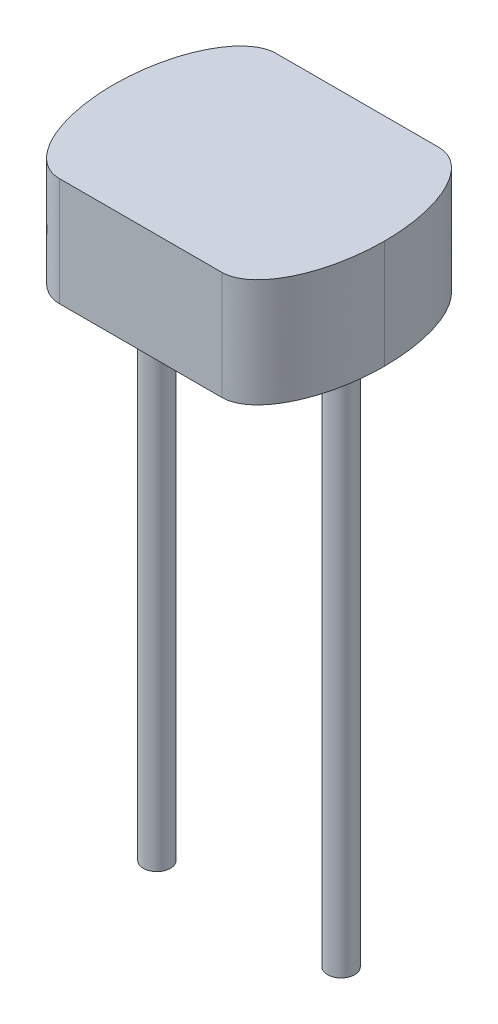
ISO-10303-21;
HEADER;
FILE_DESCRIPTION(('STEP AP214'),'2;1');
FILE_NAME('part.step','',(''),(''),'','','');
FILE_SCHEMA(('AUTOMOTIVE_DESIGN { 1 0 10303 214 1 1 1 1 }'));
ENDSEC;
DATA;
#1=APPLICATION_CONTEXT('core data for automotive mechanical design processes');
#2=APPLICATION_PROTOCOL_DEFINITION('international standard','automotive_design',2000,#1);
#3=PRODUCT_CONTEXT('',#1,'mechanical');
#4=PRODUCT('Part','Part','',(#3));
#5=PRODUCT_RELATED_PRODUCT_CATEGORY('part','',(#4));
#6=PRODUCT_DEFINITION_FORMATION('','',#4);
#7=PRODUCT_DEFINITION_CONTEXT('part definition',#1,'design');
#8=PRODUCT_DEFINITION('design','',#6,#7);
#9=PRODUCT_DEFINITION_SHAPE('','',#8);
#10=(LENGTH_UNIT() NAMED_UNIT(*) SI_UNIT(.MILLI.,.METRE.));
#11=(NAMED_UNIT(*) PLANE_ANGLE_UNIT() SI_UNIT($,.RADIAN.));
#12=(NAMED_UNIT(*) SI_UNIT($,.STERADIAN.) SOLID_ANGLE_UNIT());
#13=UNCERTAINTY_MEASURE_WITH_UNIT(LENGTH_MEASURE(1.E-05),#10,'distance_accuracy_value','');
#14=(GEOMETRIC_REPRESENTATION_CONTEXT(3) GLOBAL_UNCERTAINTY_ASSIGNED_CONTEXT((#13)) GLOBAL_UNIT_ASSIGNED_CONTEXT((#10,
#11,#12)) REPRESENTATION_CONTEXT('',''));
#15=CARTESIAN_POINT('',(0.,0.,0.));
#16=DIRECTION('',(0.,0.,1.));
#17=DIRECTION('',(1.,0.,0.));
#18=AXIS2_PLACEMENT_3D('',#15,#16,#17);
#19=CARTESIAN_POINT('',(-2.5,2.,2.));
#20=DIRECTION('',(0.,0.,-1.));
#21=DIRECTION('',(-1.,0.,0.));
#22=AXIS2_PLACEMENT_3D('',#19,#20,#21);
#23=PLANE('',#22);
#24=DIRECTION('',(1.,0.,0.));
#25=VECTOR('',#24,1.);
#26=CARTESIAN_POINT('',(-2.5,2.,2.));
#27=LINE('',#26,#25);
#28=CARTESIAN_POINT('',(-1.5,2.,2.));
#29=VERTEX_POINT('',#28);
#30=CARTESIAN_POINT('',(1.5,2.,2.));
#31=VERTEX_POINT('',#30);
#32=EDGE_CURVE('E286',#29,#31,#27,.T.);
#33=ORIENTED_EDGE('',*,*,#32,.F.);
#34=CARTESIAN_POINT('',(-1.5,-0.1,2.));
#35=CARTESIAN_POINT('',(-1.5,0.633333333333333,2.));
#36=CARTESIAN_POINT('',(-1.5,1.36666666666667,2.));
#37=CARTESIAN_POINT('',(-1.5,2.1,2.));
#38=(BOUNDED_CURVE() B_SPLINE_CURVE(3,(#34,#35,#36,#37),.UNSPECIFIED.,.F.,
.F.) B_SPLINE_CURVE_WITH_KNOTS((4,4),(-9.99999999999998E-05,0.0021),
.UNSPECIFIED.) CURVE() GEOMETRIC_REPRESENTATION_ITEM() RATIONAL_B_SPLINE_CURVE((1.,1.,1.,1.)) REPRESENTATION_ITEM(''));
#39=CARTESIAN_POINT('',(-1.5,0.,2.));
#40=VERTEX_POINT('',#39);
#41=EDGE_CURVE('E182',#29,#40,#38,.F.);
#42=ORIENTED_EDGE('',*,*,#41,.T.);
#43=DIRECTION('',(1.,0.,0.));
#44=VECTOR('',#43,1.);
#45=CARTESIAN_POINT('',(-2.5,0.,2.));
#46=LINE('',#45,#44);
#47=CARTESIAN_POINT('',(1.5,0.,2.));
#48=VERTEX_POINT('',#47);
#49=EDGE_CURVE('E110',#40,#48,#46,.T.);
#50=ORIENTED_EDGE('',*,*,#49,.T.);
#51=CARTESIAN_POINT('',(1.5,2.1,2.));
#52=CARTESIAN_POINT('',(1.5,1.36666666666667,2.));
#53=CARTESIAN_POINT('',(1.5,0.633333333333333,2.));
#54=CARTESIAN_POINT('',(1.5,-0.1,2.));
#55=(BOUNDED_CURVE() B_SPLINE_CURVE(3,(#51,#52,#53,#54),.UNSPECIFIED.,.F.,
.F.) B_SPLINE_CURVE_WITH_KNOTS((4,4),(-0.0001,0.0021),
.UNSPECIFIED.) CURVE() GEOMETRIC_REPRESENTATION_ITEM() RATIONAL_B_SPLINE_CURVE((1.,1.,1.,1.)) REPRESENTATION_ITEM(''));
#56=EDGE_CURVE('E186',#48,#31,#55,.F.);
#57=ORIENTED_EDGE('',*,*,#56,.T.);
#58=EDGE_LOOP('',(#33,#42,#50,#57));
#59=FACE_BOUND('',#58,.T.);
#60=ADVANCED_FACE('F40',(#59),#23,.F.);
#61=CARTESIAN_POINT('',(-2.5,2.,-2.));
#62=DIRECTION('',(0.,0.,1.));
#63=DIRECTION('',(1.,0.,0.));
#64=AXIS2_PLACEMENT_3D('',#61,#62,#63);
#65=PLANE('',#64);
#66=DIRECTION('',(-1.,0.,0.));
#67=VECTOR('',#66,1.);
#68=CARTESIAN_POINT('',(-2.5,2.,-2.));
#69=LINE('',#68,#67);
#70=CARTESIAN_POINT('',(1.5,2.,-2.));
#71=VERTEX_POINT('',#70);
#72=CARTESIAN_POINT('',(-1.5,2.,-2.));
#73=VERTEX_POINT('',#72);
#74=EDGE_CURVE('E135',#71,#73,#69,.T.);
#75=ORIENTED_EDGE('',*,*,#74,.F.);
#76=CARTESIAN_POINT('',(1.5,-0.1,-2.));
#77=CARTESIAN_POINT('',(1.5,0.633333333333333,-2.));
#78=CARTESIAN_POINT('',(1.5,1.36666666666667,-2.));
#79=CARTESIAN_POINT('',(1.5,2.1,-2.));
#80=(BOUNDED_CURVE() B_SPLINE_CURVE(3,(#76,#77,#78,#79),.UNSPECIFIED.,.F.,
.F.) B_SPLINE_CURVE_WITH_KNOTS((4,4),(-9.99999999999998E-05,0.0021),
.UNSPECIFIED.) CURVE() GEOMETRIC_REPRESENTATION_ITEM() RATIONAL_B_SPLINE_CURVE((1.,1.,1.,1.)) REPRESENTATION_ITEM(''));
#81=CARTESIAN_POINT('',(1.5,0.,-2.));
#82=VERTEX_POINT('',#81);
#83=EDGE_CURVE('E12',#71,#82,#80,.F.);
#84=ORIENTED_EDGE('',*,*,#83,.T.);
#85=DIRECTION('',(-1.,0.,0.));
#86=VECTOR('',#85,1.);
#87=CARTESIAN_POINT('',(-2.5,0.,-2.));
#88=LINE('',#87,#86);
#89=CARTESIAN_POINT('',(-1.5,0.,-2.));
#90=VERTEX_POINT('',#89);
#91=EDGE_CURVE('E200',#82,#90,#88,.T.);
#92=ORIENTED_EDGE('',*,*,#91,.T.);
#93=CARTESIAN_POINT('',(-1.5,2.1,-2.));
#94=CARTESIAN_POINT('',(-1.5,1.36666666666667,-2.));
#95=CARTESIAN_POINT('',(-1.5,0.633333333333333,-2.));
#96=CARTESIAN_POINT('',(-1.5,-0.1,-2.));
#97=(BOUNDED_CURVE() B_SPLINE_CURVE(3,(#93,#94,#95,#96),.UNSPECIFIED.,.F.,
.F.) B_SPLINE_CURVE_WITH_KNOTS((4,4),(-0.0001,0.0021),
.UNSPECIFIED.) CURVE() GEOMETRIC_REPRESENTATION_ITEM() RATIONAL_B_SPLINE_CURVE((1.,1.,1.,1.)) REPRESENTATION_ITEM(''));
#98=EDGE_CURVE('E127',#90,#73,#97,.F.);
#99=ORIENTED_EDGE('',*,*,#98,.T.);
#100=EDGE_LOOP('',(#75,#84,#92,#99));
#101=FACE_BOUND('',#100,.T.);
#102=ADVANCED_FACE('F199',(#101),#65,.F.);
#103=CARTESIAN_POINT('',(0.,2.,0.));
#104=DIRECTION('',(0.,-1.,0.));
#105=DIRECTION('',(0.,0.,-1.));
#106=AXIS2_PLACEMENT_3D('',#103,#104,#105);
#107=PLANE('',#106);
#108=CARTESIAN_POINT('',(-2.5,2.,0.));
#109=CARTESIAN_POINT('',(-2.5,2.,-2.));
#110=CARTESIAN_POINT('',(-1.5,2.,-2.));
#111=(BOUNDED_CURVE() B_SPLINE_CURVE(2,(#108,#109,#110),.UNSPECIFIED.,.F.,
.F.) B_SPLINE_CURVE_WITH_KNOTS((3,3),(0.,1.),
.UNSPECIFIED.) CURVE() GEOMETRIC_REPRESENTATION_ITEM() RATIONAL_B_SPLINE_CURVE((1.,
0.707106781186548,1.)) REPRESENTATION_ITEM(''));
#112=CARTESIAN_POINT('',(-2.5,2.,0.));
#113=VERTEX_POINT('',#112);
#114=EDGE_CURVE('E192',#73,#113,#111,.F.);
#115=ORIENTED_EDGE('',*,*,#114,.T.);
#116=CARTESIAN_POINT('',(-1.5,2.,2.));
#117=CARTESIAN_POINT('',(-2.5,2.,2.));
#118=CARTESIAN_POINT('',(-2.5,2.,0.));
#119=(BOUNDED_CURVE() B_SPLINE_CURVE(2,(#116,#117,#118),.UNSPECIFIED.,.F.,
.F.) B_SPLINE_CURVE_WITH_KNOTS((3,3),(0.,1.),
.UNSPECIFIED.) CURVE() GEOMETRIC_REPRESENTATION_ITEM() RATIONAL_B_SPLINE_CURVE((1.,
0.707106781186547,1.)) REPRESENTATION_ITEM(''));
#120=EDGE_CURVE('E54',#113,#29,#119,.F.);
#121=ORIENTED_EDGE('',*,*,#120,.T.);
#122=ORIENTED_EDGE('',*,*,#32,.T.);
#123=CARTESIAN_POINT('',(2.5,2.,0.));
#124=CARTESIAN_POINT('',(2.5,2.,2.));
#125=CARTESIAN_POINT('',(1.5,2.,2.));
#126=(BOUNDED_CURVE() B_SPLINE_CURVE(2,(#123,#124,#125),.UNSPECIFIED.,.F.,
.F.) B_SPLINE_CURVE_WITH_KNOTS((3,3),(0.,1.),
.UNSPECIFIED.) CURVE() GEOMETRIC_REPRESENTATION_ITEM() RATIONAL_B_SPLINE_CURVE((1.,
0.707106781186547,1.)) REPRESENTATION_ITEM(''));
#127=CARTESIAN_POINT('',(2.5,2.,0.));
#128=VERTEX_POINT('',#127);
#129=EDGE_CURVE('E194',#31,#128,#126,.F.);
#130=ORIENTED_EDGE('',*,*,#129,.T.);
#131=CARTESIAN_POINT('',(1.5,2.,-2.));
#132=CARTESIAN_POINT('',(2.5,2.,-2.));
#133=CARTESIAN_POINT('',(2.5,2.,0.));
#134=(BOUNDED_CURVE() B_SPLINE_CURVE(2,(#131,#132,#133),.UNSPECIFIED.,.F.,
.F.) B_SPLINE_CURVE_WITH_KNOTS((3,3),(0.,1.),
.UNSPECIFIED.) CURVE() GEOMETRIC_REPRESENTATION_ITEM() RATIONAL_B_SPLINE_CURVE((1.,
0.707106781186547,1.)) REPRESENTATION_ITEM(''));
#135=EDGE_CURVE('E61',#128,#71,#134,.F.);
#136=ORIENTED_EDGE('',*,*,#135,.T.);
#137=ORIENTED_EDGE('',*,*,#74,.T.);
#138=EDGE_LOOP('',(#115,#121,#122,#130,#136,#137));
#139=FACE_BOUND('',#138,.T.);
#140=ADVANCED_FACE('F312',(#139),#107,.F.);
#141=CARTESIAN_POINT('',(0.,0.,0.));
#142=DIRECTION('',(0.,-1.,0.));
#143=DIRECTION('',(0.,0.,-1.));
#144=AXIS2_PLACEMENT_3D('',#141,#142,#143);
#145=PLANE('',#144);
#146=CARTESIAN_POINT('',(1.7,0.,0.));
#147=DIRECTION('',(0.,-1.,0.));
#148=DIRECTION('',(0.,0.,1.));
#149=AXIS2_PLACEMENT_3D('',#146,#147,#148);
#150=CIRCLE('',#149,0.25);
#151=CARTESIAN_POINT('',(1.7,0.,0.25));
#152=VERTEX_POINT('',#151);
#153=EDGE_CURVE('E506',#152,#152,#150,.T.);
#154=ORIENTED_EDGE('',*,*,#153,.F.);
#155=EDGE_LOOP('',(#154));
#156=FACE_BOUND('',#155,.T.);
#157=CARTESIAN_POINT('',(-1.7,0.,0.));
#158=DIRECTION('',(0.,-1.,0.));
#159=DIRECTION('',(0.,0.,-1.));
#160=AXIS2_PLACEMENT_3D('',#157,#158,#159);
#161=CIRCLE('',#160,0.25);
#162=CARTESIAN_POINT('',(-1.7,0.,-0.25));
#163=VERTEX_POINT('',#162);
#164=EDGE_CURVE('E505',#163,#163,#161,.T.);
#165=ORIENTED_EDGE('',*,*,#164,.F.);
#166=EDGE_LOOP('',(#165));
#167=FACE_BOUND('',#166,.T.);
#168=ORIENTED_EDGE('',*,*,#49,.F.);
#169=CARTESIAN_POINT('',(-2.5,0.,0.));
#170=CARTESIAN_POINT('',(-2.5,0.,2.));
#171=CARTESIAN_POINT('',(-1.5,0.,2.));
#172=(BOUNDED_CURVE() B_SPLINE_CURVE(2,(#169,#170,#171),.UNSPECIFIED.,.F.,
.F.) B_SPLINE_CURVE_WITH_KNOTS((3,3),(0.,1.),
.UNSPECIFIED.) CURVE() GEOMETRIC_REPRESENTATION_ITEM() RATIONAL_B_SPLINE_CURVE((1.,
0.707106781186547,1.)) REPRESENTATION_ITEM(''));
#173=CARTESIAN_POINT('',(-2.5,0.,0.));
#174=VERTEX_POINT('',#173);
#175=EDGE_CURVE('E101',#40,#174,#172,.F.);
#176=ORIENTED_EDGE('',*,*,#175,.T.);
#177=CARTESIAN_POINT('',(-1.5,0.,-2.));
#178=CARTESIAN_POINT('',(-2.5,0.,-2.));
#179=CARTESIAN_POINT('',(-2.5,0.,0.));
#180=(BOUNDED_CURVE() B_SPLINE_CURVE(2,(#177,#178,#179),.UNSPECIFIED.,.F.,
.F.) B_SPLINE_CURVE_WITH_KNOTS((3,3),(0.,1.),
.UNSPECIFIED.) CURVE() GEOMETRIC_REPRESENTATION_ITEM() RATIONAL_B_SPLINE_CURVE((1.,
0.707106781186548,1.)) REPRESENTATION_ITEM(''));
#181=EDGE_CURVE('E106',#174,#90,#180,.F.);
#182=ORIENTED_EDGE('',*,*,#181,.T.);
#183=ORIENTED_EDGE('',*,*,#91,.F.);
#184=CARTESIAN_POINT('',(2.5,0.,0.));
#185=CARTESIAN_POINT('',(2.5,0.,-2.));
#186=CARTESIAN_POINT('',(1.5,0.,-2.));
#187=(BOUNDED_CURVE() B_SPLINE_CURVE(2,(#184,#185,#186),.UNSPECIFIED.,.F.,
.F.) B_SPLINE_CURVE_WITH_KNOTS((3,3),(0.,1.),
.UNSPECIFIED.) CURVE() GEOMETRIC_REPRESENTATION_ITEM() RATIONAL_B_SPLINE_CURVE((1.,
0.707106781186548,1.)) REPRESENTATION_ITEM(''));
#188=CARTESIAN_POINT('',(2.5,0.,0.));
#189=VERTEX_POINT('',#188);
#190=EDGE_CURVE('E70',#82,#189,#187,.F.);
#191=ORIENTED_EDGE('',*,*,#190,.T.);
#192=CARTESIAN_POINT('',(1.5,0.,2.));
#193=CARTESIAN_POINT('',(2.5,0.,2.));
#194=CARTESIAN_POINT('',(2.5,0.,0.));
#195=(BOUNDED_CURVE() B_SPLINE_CURVE(2,(#192,#193,#194),.UNSPECIFIED.,.F.,
.F.) B_SPLINE_CURVE_WITH_KNOTS((3,3),(0.,1.),
.UNSPECIFIED.) CURVE() GEOMETRIC_REPRESENTATION_ITEM() RATIONAL_B_SPLINE_CURVE((1.,
0.707106781186547,1.)) REPRESENTATION_ITEM(''));
#196=EDGE_CURVE('E129',#189,#48,#195,.F.);
#197=ORIENTED_EDGE('',*,*,#196,.T.);
#198=EDGE_LOOP('',(#168,#176,#182,#183,#191,#197));
#199=FACE_BOUND('',#198,.T.);
#200=ADVANCED_FACE('F104',(#156,#167,#199),#145,.T.);
#201=CARTESIAN_POINT('',(-1.7,-10.,0.));
#202=DIRECTION('',(0.,1.,0.));
#203=DIRECTION('',(0.,0.,1.));
#204=AXIS2_PLACEMENT_3D('',#201,#202,#203);
#205=CYLINDRICAL_SURFACE('',#204,0.25);
#206=CARTESIAN_POINT('',(-1.7,-10.,0.));
#207=DIRECTION('',(0.,-1.,0.));
#208=DIRECTION('',(0.,0.,-1.));
#209=AXIS2_PLACEMENT_3D('',#206,#207,#208);
#210=CIRCLE('',#209,0.25);
#211=CARTESIAN_POINT('',(-1.7,-10.,-0.25));
#212=VERTEX_POINT('',#211);
#213=EDGE_CURVE('E285',#212,#212,#210,.T.);
#214=ORIENTED_EDGE('',*,*,#213,.F.);
#215=EDGE_LOOP('',(#214));
#216=FACE_BOUND('',#215,.T.);
#217=ORIENTED_EDGE('',*,*,#164,.T.);
#218=EDGE_LOOP('',(#217));
#219=FACE_BOUND('',#218,.T.);
#220=ADVANCED_FACE('F311',(#216,#219),#205,.T.);
#221=CARTESIAN_POINT('',(-1.7,-10.,0.));
#222=DIRECTION('',(0.,-1.,0.));
#223=DIRECTION('',(0.,0.,-1.));
#224=AXIS2_PLACEMENT_3D('',#221,#222,#223);
#225=PLANE('',#224);
#226=ORIENTED_EDGE('',*,*,#213,.T.);
#227=EDGE_LOOP('',(#226));
#228=FACE_BOUND('',#227,.T.);
#229=ADVANCED_FACE('F412',(#228),#225,.T.);
#230=CARTESIAN_POINT('',(1.7,-10.,0.));
#231=DIRECTION('',(0.,1.,0.));
#232=DIRECTION('',(0.,0.,1.));
#233=AXIS2_PLACEMENT_3D('',#230,#231,#232);
#234=CYLINDRICAL_SURFACE('',#233,0.25);
#235=CARTESIAN_POINT('',(1.7,-10.,0.));
#236=DIRECTION('',(0.,-1.,0.));
#237=DIRECTION('',(0.,0.,1.));
#238=AXIS2_PLACEMENT_3D('',#235,#236,#237);
#239=CIRCLE('',#238,0.25);
#240=CARTESIAN_POINT('',(1.7,-10.,0.25));
#241=VERTEX_POINT('',#240);
#242=EDGE_CURVE('E504',#241,#241,#239,.T.);
#243=ORIENTED_EDGE('',*,*,#242,.F.);
#244=EDGE_LOOP('',(#243));
#245=FACE_BOUND('',#244,.T.);
#246=ORIENTED_EDGE('',*,*,#153,.T.);
#247=EDGE_LOOP('',(#246));
#248=FACE_BOUND('',#247,.T.);
#249=ADVANCED_FACE('F420',(#245,#248),#234,.T.);
#250=CARTESIAN_POINT('',(1.7,-10.,0.));
#251=DIRECTION('',(0.,1.,0.));
#252=DIRECTION('',(0.,0.,1.));
#253=AXIS2_PLACEMENT_3D('',#250,#251,#252);
#254=PLANE('',#253);
#255=ORIENTED_EDGE('',*,*,#242,.T.);
#256=EDGE_LOOP('',(#255));
#257=FACE_BOUND('',#256,.T.);
#258=ADVANCED_FACE('F224',(#257),#254,.F.);
#259=CARTESIAN_POINT('',(-2.5,2.1,0.));
#260=CARTESIAN_POINT('',(-2.5,1.36666666666667,0.));
#261=CARTESIAN_POINT('',(-2.5,0.633333333333333,0.));
#262=CARTESIAN_POINT('',(-2.5,-0.1,0.));
#263=CARTESIAN_POINT('',(-2.5,2.1,-2.));
#264=CARTESIAN_POINT('',(-2.5,1.36666666666667,-2.));
#265=CARTESIAN_POINT('',(-2.5,0.633333333333333,-2.));
#266=CARTESIAN_POINT('',(-2.5,-0.1,-2.));
#267=CARTESIAN_POINT('',(-1.5,2.1,-2.));
#268=CARTESIAN_POINT('',(-1.5,1.36666666666667,-2.));
#269=CARTESIAN_POINT('',(-1.5,0.633333333333333,-2.));
#270=CARTESIAN_POINT('',(-1.5,-0.1,-2.));
#271=(BOUNDED_SURFACE() B_SPLINE_SURFACE(2,3,((#259,#260,#261,#262),(#263,#264,#265,#266),(#267,
#268,#269,#270)),.UNSPECIFIED.,.F.,.F.,.F.) B_SPLINE_SURFACE_WITH_KNOTS((3,3),(4,4),(0.,1.),
(-0.0001,0.0021),.UNSPECIFIED.) GEOMETRIC_REPRESENTATION_ITEM() RATIONAL_B_SPLINE_SURFACE(((1.,
1.,1.,1.),(0.707106781186548,0.707106781186548,0.707106781186548,0.707106781186548),(1.,1.,1.,1.))) REPRESENTATION_ITEM('') SURFACE());
#272=CARTESIAN_POINT('',(-2.5,2.1,0.));
#273=CARTESIAN_POINT('',(-2.5,1.36666666666667,0.));
#274=CARTESIAN_POINT('',(-2.5,0.633333333333333,0.));
#275=CARTESIAN_POINT('',(-2.5,-0.1,0.));
#276=(BOUNDED_CURVE() B_SPLINE_CURVE(3,(#272,#273,#274,#275),.UNSPECIFIED.,.F.,
.F.) B_SPLINE_CURVE_WITH_KNOTS((4,4),(-0.0001,0.0021),
.UNSPECIFIED.) CURVE() GEOMETRIC_REPRESENTATION_ITEM() RATIONAL_B_SPLINE_CURVE((1.,1.,1.,1.)) REPRESENTATION_ITEM(''));
#277=EDGE_CURVE('E123',#113,#174,#276,.T.);
#278=ORIENTED_EDGE('',*,*,#114,.F.);
#279=ORIENTED_EDGE('',*,*,#98,.F.);
#280=ORIENTED_EDGE('',*,*,#181,.F.);
#281=ORIENTED_EDGE('',*,*,#277,.F.);
#282=EDGE_LOOP('',(#278,#279,#280,#281));
#283=FACE_BOUND('',#282,.T.);
#284=ADVANCED_FACE('F122',(#283),#271,.T.);
#285=CARTESIAN_POINT('',(2.5,2.1,0.));
#286=CARTESIAN_POINT('',(2.5,1.36666666666667,0.));
#287=CARTESIAN_POINT('',(2.5,0.633333333333333,0.));
#288=CARTESIAN_POINT('',(2.5,-0.1,0.));
#289=CARTESIAN_POINT('',(2.5,2.1,2.));
#290=CARTESIAN_POINT('',(2.5,1.36666666666667,2.));
#291=CARTESIAN_POINT('',(2.5,0.633333333333333,2.));
#292=CARTESIAN_POINT('',(2.5,-0.1,2.));
#293=CARTESIAN_POINT('',(1.5,2.1,2.));
#294=CARTESIAN_POINT('',(1.5,1.36666666666667,2.));
#295=CARTESIAN_POINT('',(1.5,0.633333333333333,2.));
#296=CARTESIAN_POINT('',(1.5,-0.1,2.));
#297=(BOUNDED_SURFACE() B_SPLINE_SURFACE(2,3,((#285,#286,#287,#288),(#289,#290,#291,#292),(#293,
#294,#295,#296)),.UNSPECIFIED.,.F.,.F.,.F.) B_SPLINE_SURFACE_WITH_KNOTS((3,3),(4,4),(0.,1.),
(-0.0001,0.0021),.UNSPECIFIED.) GEOMETRIC_REPRESENTATION_ITEM() RATIONAL_B_SPLINE_SURFACE(((1.,
1.,1.,1.),(0.707106781186547,0.707106781186547,0.707106781186547,0.707106781186547),(1.,1.,1.,1.))) REPRESENTATION_ITEM('') SURFACE());
#298=CARTESIAN_POINT('',(2.5,2.1,0.));
#299=CARTESIAN_POINT('',(2.5,1.36666666666667,0.));
#300=CARTESIAN_POINT('',(2.5,0.633333333333333,0.));
#301=CARTESIAN_POINT('',(2.5,-0.1,0.));
#302=(BOUNDED_CURVE() B_SPLINE_CURVE(3,(#298,#299,#300,#301),.UNSPECIFIED.,.F.,
.F.) B_SPLINE_CURVE_WITH_KNOTS((4,4),(-0.0001,0.0021),
.UNSPECIFIED.) CURVE() GEOMETRIC_REPRESENTATION_ITEM() RATIONAL_B_SPLINE_CURVE((1.,1.,1.,1.)) REPRESENTATION_ITEM(''));
#303=EDGE_CURVE('E188',#128,#189,#302,.T.);
#304=ORIENTED_EDGE('',*,*,#129,.F.);
#305=ORIENTED_EDGE('',*,*,#56,.F.);
#306=ORIENTED_EDGE('',*,*,#196,.F.);
#307=ORIENTED_EDGE('',*,*,#303,.F.);
#308=EDGE_LOOP('',(#304,#305,#306,#307));
#309=FACE_BOUND('',#308,.T.);
#310=ADVANCED_FACE('F157',(#309),#297,.T.);
#311=CARTESIAN_POINT('',(-1.5,2.1,2.));
#312=CARTESIAN_POINT('',(-1.5,1.36666666666667,2.));
#313=CARTESIAN_POINT('',(-1.5,0.633333333333333,2.));
#314=CARTESIAN_POINT('',(-1.5,-0.1,2.));
#315=CARTESIAN_POINT('',(-2.5,2.1,2.));
#316=CARTESIAN_POINT('',(-2.5,1.36666666666667,2.));
#317=CARTESIAN_POINT('',(-2.5,0.633333333333333,2.));
#318=CARTESIAN_POINT('',(-2.5,-0.1,2.));
#319=CARTESIAN_POINT('',(-2.5,2.1,0.));
#320=CARTESIAN_POINT('',(-2.5,1.36666666666667,0.));
#321=CARTESIAN_POINT('',(-2.5,0.633333333333333,0.));
#322=CARTESIAN_POINT('',(-2.5,-0.1,0.));
#323=(BOUNDED_SURFACE() B_SPLINE_SURFACE(2,3,((#311,#312,#313,#314),(#315,#316,#317,#318),(#319,
#320,#321,#322)),.UNSPECIFIED.,.F.,.F.,.F.) B_SPLINE_SURFACE_WITH_KNOTS((3,3),(4,4),(0.,1.),
(-0.0001,0.0021),.UNSPECIFIED.) GEOMETRIC_REPRESENTATION_ITEM() RATIONAL_B_SPLINE_SURFACE(((1.,
1.,1.,1.),(0.707106781186547,0.707106781186547,0.707106781186547,0.707106781186547),(1.,1.,1.,1.))) REPRESENTATION_ITEM('') SURFACE());
#324=ORIENTED_EDGE('',*,*,#120,.F.);
#325=ORIENTED_EDGE('',*,*,#277,.T.);
#326=ORIENTED_EDGE('',*,*,#175,.F.);
#327=ORIENTED_EDGE('',*,*,#41,.F.);
#328=EDGE_LOOP('',(#324,#325,#326,#327));
#329=FACE_BOUND('',#328,.T.);
#330=ADVANCED_FACE('F133',(#329),#323,.T.);
#331=CARTESIAN_POINT('',(1.5,2.1,-2.));
#332=CARTESIAN_POINT('',(1.5,1.36666666666667,-2.));
#333=CARTESIAN_POINT('',(1.5,0.633333333333333,-2.));
#334=CARTESIAN_POINT('',(1.5,-0.1,-2.));
#335=CARTESIAN_POINT('',(2.5,2.1,-2.));
#336=CARTESIAN_POINT('',(2.5,1.36666666666667,-2.));
#337=CARTESIAN_POINT('',(2.5,0.633333333333333,-2.));
#338=CARTESIAN_POINT('',(2.5,-0.1,-2.));
#339=CARTESIAN_POINT('',(2.5,2.1,0.));
#340=CARTESIAN_POINT('',(2.5,1.36666666666667,0.));
#341=CARTESIAN_POINT('',(2.5,0.633333333333333,0.));
#342=CARTESIAN_POINT('',(2.5,-0.1,0.));
#343=(BOUNDED_SURFACE() B_SPLINE_SURFACE(2,3,((#331,#332,#333,#334),(#335,#336,#337,#338),(#339,
#340,#341,#342)),.UNSPECIFIED.,.F.,.F.,.F.) B_SPLINE_SURFACE_WITH_KNOTS((3,3),(4,4),(0.,1.),
(-0.0001,0.0021),.UNSPECIFIED.) GEOMETRIC_REPRESENTATION_ITEM() RATIONAL_B_SPLINE_SURFACE(((1.,
1.,1.,1.),(0.707106781186548,0.707106781186548,0.707106781186548,0.707106781186548),(1.,1.,1.,1.))) REPRESENTATION_ITEM('') SURFACE());
#344=ORIENTED_EDGE('',*,*,#135,.F.);
#345=ORIENTED_EDGE('',*,*,#303,.T.);
#346=ORIENTED_EDGE('',*,*,#190,.F.);
#347=ORIENTED_EDGE('',*,*,#83,.F.);
#348=EDGE_LOOP('',(#344,#345,#346,#347));
#349=FACE_BOUND('',#348,.T.);
#350=ADVANCED_FACE('F43',(#349),#343,.T.);
#351=CLOSED_SHELL('',(#60,#102,#140,#200,#220,#229,#249,#258,#284,#310,#330,#350));
#352=MANIFOLD_SOLID_BREP('B2',#351);
#353=ADVANCED_BREP_SHAPE_REPRESENTATION('',(#18,#352),#14);
#354=SHAPE_DEFINITION_REPRESENTATION(#9,#353);
ENDSEC;
END-ISO-10303-21;
